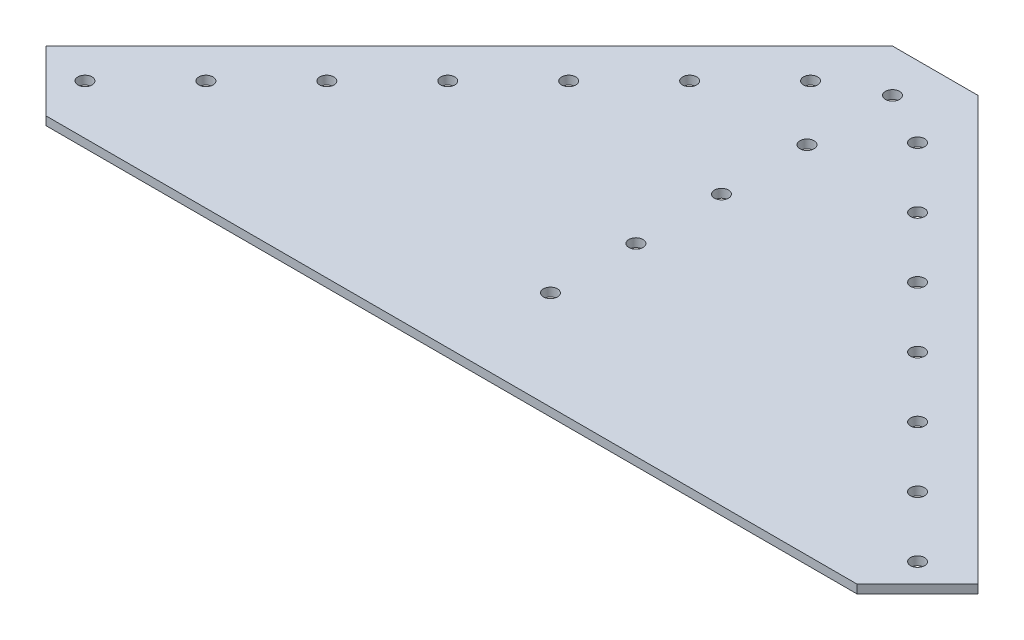
ISO-10303-21;
HEADER;
FILE_DESCRIPTION(('STEP AP214'),'2;1');
FILE_NAME('part.step','',(''),(''),'','','');
FILE_SCHEMA(('AUTOMOTIVE_DESIGN { 1 0 10303 214 1 1 1 1 }'));
ENDSEC;
DATA;
#1=APPLICATION_CONTEXT('core data for automotive mechanical design processes');
#2=APPLICATION_PROTOCOL_DEFINITION('international standard','automotive_design',2000,#1);
#3=PRODUCT_CONTEXT('',#1,'mechanical');
#4=PRODUCT('Part','Part','',(#3));
#5=PRODUCT_RELATED_PRODUCT_CATEGORY('part','',(#4));
#6=PRODUCT_DEFINITION_FORMATION('','',#4);
#7=PRODUCT_DEFINITION_CONTEXT('part definition',#1,'design');
#8=PRODUCT_DEFINITION('design','',#6,#7);
#9=PRODUCT_DEFINITION_SHAPE('','',#8);
#10=(LENGTH_UNIT() NAMED_UNIT(*) SI_UNIT(.MILLI.,.METRE.));
#11=(NAMED_UNIT(*) PLANE_ANGLE_UNIT() SI_UNIT($,.RADIAN.));
#12=(NAMED_UNIT(*) SI_UNIT($,.STERADIAN.) SOLID_ANGLE_UNIT());
#13=UNCERTAINTY_MEASURE_WITH_UNIT(LENGTH_MEASURE(1.E-05),#10,'distance_accuracy_value','');
#14=(GEOMETRIC_REPRESENTATION_CONTEXT(3) GLOBAL_UNCERTAINTY_ASSIGNED_CONTEXT((#13)) GLOBAL_UNIT_ASSIGNED_CONTEXT((#10,
#11,#12)) REPRESENTATION_CONTEXT('',''));
#15=CARTESIAN_POINT('',(0.,0.,0.));
#16=DIRECTION('',(0.,0.,1.));
#17=DIRECTION('',(1.,0.,0.));
#18=AXIS2_PLACEMENT_3D('',#15,#16,#17);
#19=CARTESIAN_POINT('',(0.,2.54,0.));
#20=DIRECTION('',(0.707106781186548,0.,0.707106781186548));
#21=DIRECTION('',(0.707106781186548,0.,-0.707106781186548));
#22=AXIS2_PLACEMENT_3D('',#19,#20,#21);
#23=PLANE('',#22);
#24=DIRECTION('',(-0.707106781186547,0.,0.707106781186547));
#25=VECTOR('',#24,1.);
#26=CARTESIAN_POINT('',(0.,0.,0.));
#27=LINE('',#26,#25);
#28=CARTESIAN_POINT('',(0.,0.,0.));
#29=VERTEX_POINT('',#28);
#30=CARTESIAN_POINT('',(-125.723585694968,0.,125.723585694968));
#31=VERTEX_POINT('',#30);
#32=EDGE_CURVE('E142',#29,#31,#27,.T.);
#33=ORIENTED_EDGE('',*,*,#32,.T.);
#34=DIRECTION('',(0.,-1.,0.));
#35=VECTOR('',#34,1.);
#36=CARTESIAN_POINT('',(-125.723585694968,2.54,125.723585694968));
#37=LINE('',#36,#35);
#38=CARTESIAN_POINT('',(-125.723585694968,2.54,125.723585694968));
#39=VERTEX_POINT('',#38);
#40=EDGE_CURVE('E11',#39,#31,#37,.T.);
#41=ORIENTED_EDGE('',*,*,#40,.F.);
#42=DIRECTION('',(-0.707106781186547,0.,0.707106781186547));
#43=VECTOR('',#42,1.);
#44=CARTESIAN_POINT('',(0.,2.54,0.));
#45=LINE('',#44,#43);
#46=CARTESIAN_POINT('',(0.,2.54,0.));
#47=VERTEX_POINT('',#46);
#48=EDGE_CURVE('E159',#47,#39,#45,.T.);
#49=ORIENTED_EDGE('',*,*,#48,.F.);
#50=DIRECTION('',(0.,-1.,0.));
#51=VECTOR('',#50,1.);
#52=CARTESIAN_POINT('',(0.,2.54,0.));
#53=LINE('',#52,#51);
#54=EDGE_CURVE('E138',#47,#29,#53,.T.);
#55=ORIENTED_EDGE('',*,*,#54,.T.);
#56=EDGE_LOOP('',(#33,#41,#49,#55));
#57=FACE_BOUND('',#56,.T.);
#58=ADVANCED_FACE('F42',(#57),#23,.F.);
#59=CARTESIAN_POINT('',(-125.723585694968,2.54,125.723585694968));
#60=DIRECTION('',(0.707106781186547,0.,-0.707106781186548));
#61=DIRECTION('',(-0.707106781186548,0.,-0.707106781186547));
#62=AXIS2_PLACEMENT_3D('',#59,#60,#61);
#63=PLANE('',#62);
#64=DIRECTION('',(0.707106781186548,0.,0.707106781186547));
#65=VECTOR('',#64,1.);
#66=CARTESIAN_POINT('',(-125.723585694968,0.,125.723585694968));
#67=LINE('',#66,#65);
#68=CARTESIAN_POINT('',(-107.76307345283,0.,143.684097937106));
#69=VERTEX_POINT('',#68);
#70=EDGE_CURVE('E146',#31,#69,#67,.T.);
#71=ORIENTED_EDGE('',*,*,#70,.T.);
#72=DIRECTION('',(0.,-1.,0.));
#73=VECTOR('',#72,1.);
#74=CARTESIAN_POINT('',(-107.76307345283,2.54,143.684097937106));
#75=LINE('',#74,#73);
#76=CARTESIAN_POINT('',(-107.76307345283,2.54,143.684097937106));
#77=VERTEX_POINT('',#76);
#78=EDGE_CURVE('E50',#77,#69,#75,.T.);
#79=ORIENTED_EDGE('',*,*,#78,.F.);
#80=DIRECTION('',(0.707106781186548,0.,0.707106781186547));
#81=VECTOR('',#80,1.);
#82=CARTESIAN_POINT('',(-125.723585694968,2.54,125.723585694968));
#83=LINE('',#82,#81);
#84=EDGE_CURVE('E102',#39,#77,#83,.T.);
#85=ORIENTED_EDGE('',*,*,#84,.F.);
#86=ORIENTED_EDGE('',*,*,#40,.T.);
#87=EDGE_LOOP('',(#71,#79,#85,#86));
#88=FACE_BOUND('',#87,.T.);
#89=ADVANCED_FACE('F186',(#88),#63,.F.);
#90=CARTESIAN_POINT('',(-107.76307345283,2.54,143.684097937106));
#91=DIRECTION('',(0.,0.,-1.));
#92=DIRECTION('',(-1.,0.,0.));
#93=AXIS2_PLACEMENT_3D('',#90,#91,#92);
#94=PLANE('',#93);
#95=DIRECTION('',(1.,0.,0.));
#96=VECTOR('',#95,1.);
#97=CARTESIAN_POINT('',(-107.76307345283,0.,143.684097937106));
#98=LINE('',#97,#96);
#99=CARTESIAN_POINT('',(133.16307345283,0.,143.684097937106));
#100=VERTEX_POINT('',#99);
#101=EDGE_CURVE('E150',#69,#100,#98,.T.);
#102=ORIENTED_EDGE('',*,*,#101,.T.);
#103=DIRECTION('',(0.,-1.,0.));
#104=VECTOR('',#103,1.);
#105=CARTESIAN_POINT('',(133.16307345283,2.54,143.684097937106));
#106=LINE('',#105,#104);
#107=CARTESIAN_POINT('',(133.16307345283,2.54,143.684097937106));
#108=VERTEX_POINT('',#107);
#109=EDGE_CURVE('E129',#108,#100,#106,.T.);
#110=ORIENTED_EDGE('',*,*,#109,.F.);
#111=DIRECTION('',(1.,0.,0.));
#112=VECTOR('',#111,1.);
#113=CARTESIAN_POINT('',(-107.76307345283,2.54,143.684097937106));
#114=LINE('',#113,#112);
#115=EDGE_CURVE('E118',#77,#108,#114,.T.);
#116=ORIENTED_EDGE('',*,*,#115,.F.);
#117=ORIENTED_EDGE('',*,*,#78,.T.);
#118=EDGE_LOOP('',(#102,#110,#116,#117));
#119=FACE_BOUND('',#118,.T.);
#120=ADVANCED_FACE('F167',(#119),#94,.F.);
#121=CARTESIAN_POINT('',(151.123585694968,2.54,125.723585694968));
#122=DIRECTION('',(-0.707106781186548,0.,-0.707106781186547));
#123=DIRECTION('',(-0.707106781186547,0.,0.707106781186548));
#124=AXIS2_PLACEMENT_3D('',#121,#122,#123);
#125=PLANE('',#124);
#126=DIRECTION('',(0.707106781186547,0.,-0.707106781186548));
#127=VECTOR('',#126,1.);
#128=CARTESIAN_POINT('',(151.123585694968,0.,125.723585694968));
#129=LINE('',#128,#127);
#130=CARTESIAN_POINT('',(151.123585694968,0.,125.723585694968));
#131=VERTEX_POINT('',#130);
#132=EDGE_CURVE('E127',#100,#131,#129,.T.);
#133=ORIENTED_EDGE('',*,*,#132,.T.);
#134=DIRECTION('',(0.,-1.,0.));
#135=VECTOR('',#134,1.);
#136=CARTESIAN_POINT('',(151.123585694968,2.54,125.723585694968));
#137=LINE('',#136,#135);
#138=CARTESIAN_POINT('',(151.123585694968,2.54,125.723585694968));
#139=VERTEX_POINT('',#138);
#140=EDGE_CURVE('E124',#139,#131,#137,.T.);
#141=ORIENTED_EDGE('',*,*,#140,.F.);
#142=DIRECTION('',(0.707106781186547,0.,-0.707106781186548));
#143=VECTOR('',#142,1.);
#144=CARTESIAN_POINT('',(151.123585694968,2.54,125.723585694968));
#145=LINE('',#144,#143);
#146=EDGE_CURVE('E112',#108,#139,#145,.T.);
#147=ORIENTED_EDGE('',*,*,#146,.F.);
#148=ORIENTED_EDGE('',*,*,#109,.T.);
#149=EDGE_LOOP('',(#133,#141,#147,#148));
#150=FACE_BOUND('',#149,.T.);
#151=ADVANCED_FACE('F125',(#150),#125,.F.);
#152=CARTESIAN_POINT('',(25.4,2.54,0.));
#153=DIRECTION('',(-0.707106781186548,0.,0.707106781186548));
#154=DIRECTION('',(0.707106781186548,0.,0.707106781186548));
#155=AXIS2_PLACEMENT_3D('',#152,#153,#154);
#156=PLANE('',#155);
#157=DIRECTION('',(-0.707106781186547,0.,-0.707106781186547));
#158=VECTOR('',#157,1.);
#159=CARTESIAN_POINT('',(25.4,0.,0.));
#160=LINE('',#159,#158);
#161=CARTESIAN_POINT('',(25.4,0.,0.));
#162=VERTEX_POINT('',#161);
#163=EDGE_CURVE('E88',#131,#162,#160,.T.);
#164=ORIENTED_EDGE('',*,*,#163,.T.);
#165=DIRECTION('',(0.,-1.,0.));
#166=VECTOR('',#165,1.);
#167=CARTESIAN_POINT('',(25.4,2.54,0.));
#168=LINE('',#167,#166);
#169=CARTESIAN_POINT('',(25.4,2.54,0.));
#170=VERTEX_POINT('',#169);
#171=EDGE_CURVE('E130',#170,#162,#168,.T.);
#172=ORIENTED_EDGE('',*,*,#171,.F.);
#173=DIRECTION('',(-0.707106781186547,0.,-0.707106781186547));
#174=VECTOR('',#173,1.);
#175=CARTESIAN_POINT('',(25.4,2.54,0.));
#176=LINE('',#175,#174);
#177=EDGE_CURVE('E116',#139,#170,#176,.T.);
#178=ORIENTED_EDGE('',*,*,#177,.F.);
#179=ORIENTED_EDGE('',*,*,#140,.T.);
#180=EDGE_LOOP('',(#164,#172,#178,#179));
#181=FACE_BOUND('',#180,.T.);
#182=ADVANCED_FACE('F132',(#181),#156,.F.);
#183=CARTESIAN_POINT('',(0.,2.54,0.));
#184=DIRECTION('',(0.,0.,1.));
#185=DIRECTION('',(1.,0.,0.));
#186=AXIS2_PLACEMENT_3D('',#183,#184,#185);
#187=PLANE('',#186);
#188=DIRECTION('',(-1.,0.,0.));
#189=VECTOR('',#188,1.);
#190=CARTESIAN_POINT('',(0.,0.,0.));
#191=LINE('',#190,#189);
#192=EDGE_CURVE('E94',#162,#29,#191,.T.);
#193=ORIENTED_EDGE('',*,*,#192,.T.);
#194=ORIENTED_EDGE('',*,*,#54,.F.);
#195=DIRECTION('',(-1.,0.,0.));
#196=VECTOR('',#195,1.);
#197=CARTESIAN_POINT('',(0.,2.54,0.));
#198=LINE('',#197,#196);
#199=EDGE_CURVE('E61',#170,#47,#198,.T.);
#200=ORIENTED_EDGE('',*,*,#199,.F.);
#201=ORIENTED_EDGE('',*,*,#171,.T.);
#202=EDGE_LOOP('',(#193,#194,#200,#201));
#203=FACE_BOUND('',#202,.T.);
#204=ADVANCED_FACE('F174',(#203),#187,.F.);
#205=CARTESIAN_POINT('',(0.,2.54,0.));
#206=DIRECTION('',(0.,1.,0.));
#207=DIRECTION('',(0.,0.,1.));
#208=AXIS2_PLACEMENT_3D('',#205,#206,#207);
#209=PLANE('',#208);
#210=CARTESIAN_POINT('',(-21.151548004717,2.54,39.1120602468554));
#211=DIRECTION('',(0.,-1.,0.));
#212=DIRECTION('',(0.,0.,-1.));
#213=AXIS2_PLACEMENT_3D('',#210,#211,#212);
#214=CIRCLE('',#213,2.09549999999999);
#215=CARTESIAN_POINT('',(-21.151548004717,2.54,37.0165602468554));
#216=VERTEX_POINT('',#215);
#217=EDGE_CURVE('E444',#216,#216,#214,.T.);
#218=ORIENTED_EDGE('',*,*,#217,.T.);
#219=EDGE_LOOP('',(#218));
#220=FACE_BOUND('',#219,.T.);
#221=CARTESIAN_POINT('',(-39.1120602468553,2.54,57.0725724889937));
#222=DIRECTION('',(0.,-1.,0.));
#223=DIRECTION('',(0.,0.,-1.));
#224=AXIS2_PLACEMENT_3D('',#221,#222,#223);
#225=CIRCLE('',#224,2.09549999999999);
#226=CARTESIAN_POINT('',(-39.1120602468553,2.54,54.9770724889937));
#227=VERTEX_POINT('',#226);
#228=EDGE_CURVE('E458',#227,#227,#225,.T.);
#229=ORIENTED_EDGE('',*,*,#228,.T.);
#230=EDGE_LOOP('',(#229));
#231=FACE_BOUND('',#230,.T.);
#232=CARTESIAN_POINT('',(-57.0725724889936,2.54,75.033084731132));
#233=DIRECTION('',(0.,-1.,0.));
#234=DIRECTION('',(0.,0.,-1.));
#235=AXIS2_PLACEMENT_3D('',#232,#233,#234);
#236=CIRCLE('',#235,2.09549999999999);
#237=CARTESIAN_POINT('',(-57.0725724889936,2.54,72.937584731132));
#238=VERTEX_POINT('',#237);
#239=EDGE_CURVE('E465',#238,#238,#236,.T.);
#240=ORIENTED_EDGE('',*,*,#239,.T.);
#241=EDGE_LOOP('',(#240));
#242=FACE_BOUND('',#241,.T.);
#243=CARTESIAN_POINT('',(-75.0330847311319,2.54,92.9935969732703));
#244=DIRECTION('',(0.,-1.,0.));
#245=DIRECTION('',(0.,0.,-1.));
#246=AXIS2_PLACEMENT_3D('',#243,#244,#245);
#247=CIRCLE('',#246,2.09549999999999);
#248=CARTESIAN_POINT('',(-75.0330847311319,2.54,90.8980969732703));
#249=VERTEX_POINT('',#248);
#250=EDGE_CURVE('E473',#249,#249,#247,.T.);
#251=ORIENTED_EDGE('',*,*,#250,.T.);
#252=EDGE_LOOP('',(#251));
#253=FACE_BOUND('',#252,.T.);
#254=CARTESIAN_POINT('',(-92.9935969732702,2.54,110.954109215409));
#255=DIRECTION('',(0.,-1.,0.));
#256=DIRECTION('',(0.,0.,-1.));
#257=AXIS2_PLACEMENT_3D('',#254,#255,#256);
#258=CIRCLE('',#257,2.09549999999999);
#259=CARTESIAN_POINT('',(-92.9935969732702,2.54,108.858609215409));
#260=VERTEX_POINT('',#259);
#261=EDGE_CURVE('E481',#260,#260,#258,.T.);
#262=ORIENTED_EDGE('',*,*,#261,.T.);
#263=EDGE_LOOP('',(#262));
#264=FACE_BOUND('',#263,.T.);
#265=CARTESIAN_POINT('',(-110.954109215409,2.54,128.914621457547));
#266=DIRECTION('',(0.,-1.,0.));
#267=DIRECTION('',(0.,0.,-1.));
#268=AXIS2_PLACEMENT_3D('',#265,#266,#267);
#269=CIRCLE('',#268,2.09549999999999);
#270=CARTESIAN_POINT('',(-110.954109215409,2.54,126.819121457547));
#271=VERTEX_POINT('',#270);
#272=EDGE_CURVE('E488',#271,#271,#269,.T.);
#273=ORIENTED_EDGE('',*,*,#272,.T.);
#274=EDGE_LOOP('',(#273));
#275=FACE_BOUND('',#274,.T.);
#276=CARTESIAN_POINT('',(28.5910357625781,2.54,21.1515480047147));
#277=DIRECTION('',(0.,-1.,0.));
#278=DIRECTION('',(0.,0.,-1.));
#279=AXIS2_PLACEMENT_3D('',#276,#277,#278);
#280=CIRCLE('',#279,2.09549999999999);
#281=CARTESIAN_POINT('',(28.5910357625781,2.54,19.0560480047147));
#282=VERTEX_POINT('',#281);
#283=EDGE_CURVE('E495',#282,#282,#280,.T.);
#284=ORIENTED_EDGE('',*,*,#283,.T.);
#285=EDGE_LOOP('',(#284));
#286=FACE_BOUND('',#285,.T.);
#287=CARTESIAN_POINT('',(46.5515480047165,2.54,39.1120602468529));
#288=DIRECTION('',(0.,-1.,0.));
#289=DIRECTION('',(0.,0.,-1.));
#290=AXIS2_PLACEMENT_3D('',#287,#288,#289);
#291=CIRCLE('',#290,2.09549999999999);
#292=CARTESIAN_POINT('',(46.5515480047165,2.54,37.0165602468529));
#293=VERTEX_POINT('',#292);
#294=EDGE_CURVE('E503',#293,#293,#291,.T.);
#295=ORIENTED_EDGE('',*,*,#294,.T.);
#296=EDGE_LOOP('',(#295));
#297=FACE_BOUND('',#296,.T.);
#298=CARTESIAN_POINT('',(64.5120602468549,2.54,57.0725724889912));
#299=DIRECTION('',(0.,-1.,0.));
#300=DIRECTION('',(0.,0.,-1.));
#301=AXIS2_PLACEMENT_3D('',#298,#299,#300);
#302=CIRCLE('',#301,2.09549999999999);
#303=CARTESIAN_POINT('',(64.5120602468549,2.54,54.9770724889912));
#304=VERTEX_POINT('',#303);
#305=EDGE_CURVE('E511',#304,#304,#302,.T.);
#306=ORIENTED_EDGE('',*,*,#305,.T.);
#307=EDGE_LOOP('',(#306));
#308=FACE_BOUND('',#307,.T.);
#309=CARTESIAN_POINT('',(82.4725724889933,2.54,75.0330847311294));
#310=DIRECTION('',(0.,-1.,0.));
#311=DIRECTION('',(0.,0.,-1.));
#312=AXIS2_PLACEMENT_3D('',#309,#310,#311);
#313=CIRCLE('',#312,2.09549999999999);
#314=CARTESIAN_POINT('',(82.4725724889933,2.54,72.9375847311294));
#315=VERTEX_POINT('',#314);
#316=EDGE_CURVE('E519',#315,#315,#313,.T.);
#317=ORIENTED_EDGE('',*,*,#316,.T.);
#318=EDGE_LOOP('',(#317));
#319=FACE_BOUND('',#318,.T.);
#320=CARTESIAN_POINT('',(100.433084731132,2.54,92.9935969732676));
#321=DIRECTION('',(0.,-1.,0.));
#322=DIRECTION('',(0.,0.,-1.));
#323=AXIS2_PLACEMENT_3D('',#320,#321,#322);
#324=CIRCLE('',#323,2.09549999999999);
#325=CARTESIAN_POINT('',(100.433084731132,2.54,90.8980969732677));
#326=VERTEX_POINT('',#325);
#327=EDGE_CURVE('E527',#326,#326,#324,.T.);
#328=ORIENTED_EDGE('',*,*,#327,.T.);
#329=EDGE_LOOP('',(#328));
#330=FACE_BOUND('',#329,.T.);
#331=CARTESIAN_POINT('',(118.39359697327,2.54,110.954109215406));
#332=DIRECTION('',(0.,-1.,0.));
#333=DIRECTION('',(0.,0.,-1.));
#334=AXIS2_PLACEMENT_3D('',#331,#332,#333);
#335=CIRCLE('',#334,2.09549999999999);
#336=CARTESIAN_POINT('',(118.39359697327,2.54,108.858609215406));
#337=VERTEX_POINT('',#336);
#338=EDGE_CURVE('E535',#337,#337,#335,.T.);
#339=ORIENTED_EDGE('',*,*,#338,.T.);
#340=EDGE_LOOP('',(#339));
#341=FACE_BOUND('',#340,.T.);
#342=CARTESIAN_POINT('',(136.354109215408,2.54,128.914621457544));
#343=DIRECTION('',(0.,-1.,0.));
#344=DIRECTION('',(0.,0.,-1.));
#345=AXIS2_PLACEMENT_3D('',#342,#343,#344);
#346=CIRCLE('',#345,2.0955);
#347=CARTESIAN_POINT('',(136.354109215408,2.54,126.819121457544));
#348=VERTEX_POINT('',#347);
#349=EDGE_CURVE('E543',#348,#348,#346,.T.);
#350=ORIENTED_EDGE('',*,*,#349,.T.);
#351=EDGE_LOOP('',(#350));
#352=FACE_BOUND('',#351,.T.);
#353=CARTESIAN_POINT('',(-3.1910357625787,2.54,21.1515480047171));
#354=DIRECTION('',(0.,-1.,0.));
#355=DIRECTION('',(0.,0.,-1.));
#356=AXIS2_PLACEMENT_3D('',#353,#354,#355);
#357=CIRCLE('',#356,2.09549999999999);
#358=CARTESIAN_POINT('',(-3.1910357625787,2.54,19.0560480047171));
#359=VERTEX_POINT('',#358);
#360=EDGE_CURVE('E551',#359,#359,#357,.T.);
#361=ORIENTED_EDGE('',*,*,#360,.T.);
#362=EDGE_LOOP('',(#361));
#363=FACE_BOUND('',#362,.T.);
#364=CARTESIAN_POINT('',(12.7,2.54,12.7));
#365=DIRECTION('',(0.,1.,0.));
#366=DIRECTION('',(0.,0.,1.));
#367=AXIS2_PLACEMENT_3D('',#364,#365,#366);
#368=CIRCLE('',#367,2.0955);
#369=CARTESIAN_POINT('',(12.7,2.54,14.7955));
#370=VERTEX_POINT('',#369);
#371=EDGE_CURVE('E147',#370,#370,#368,.T.);
#372=ORIENTED_EDGE('',*,*,#371,.F.);
#373=EDGE_LOOP('',(#372));
#374=FACE_BOUND('',#373,.T.);
#375=CARTESIAN_POINT('',(12.7000000000003,2.54,38.1));
#376=DIRECTION('',(0.,1.,0.));
#377=DIRECTION('',(0.,0.,1.));
#378=AXIS2_PLACEMENT_3D('',#375,#376,#377);
#379=CIRCLE('',#378,2.0955);
#380=CARTESIAN_POINT('',(12.7000000000003,2.54,40.1955));
#381=VERTEX_POINT('',#380);
#382=EDGE_CURVE('E586',#381,#381,#379,.T.);
#383=ORIENTED_EDGE('',*,*,#382,.F.);
#384=EDGE_LOOP('',(#383));
#385=FACE_BOUND('',#384,.T.);
#386=CARTESIAN_POINT('',(12.7000000000005,2.54,63.5));
#387=DIRECTION('',(0.,1.,0.));
#388=DIRECTION('',(0.,0.,1.));
#389=AXIS2_PLACEMENT_3D('',#386,#387,#388);
#390=CIRCLE('',#389,2.0955);
#391=CARTESIAN_POINT('',(12.7000000000005,2.54,65.5955));
#392=VERTEX_POINT('',#391);
#393=EDGE_CURVE('E582',#392,#392,#390,.T.);
#394=ORIENTED_EDGE('',*,*,#393,.F.);
#395=EDGE_LOOP('',(#394));
#396=FACE_BOUND('',#395,.T.);
#397=CARTESIAN_POINT('',(12.7000000000008,2.54,88.9));
#398=DIRECTION('',(0.,1.,0.));
#399=DIRECTION('',(0.,0.,1.));
#400=AXIS2_PLACEMENT_3D('',#397,#398,#399);
#401=CIRCLE('',#400,2.0955);
#402=CARTESIAN_POINT('',(12.7000000000008,2.54,90.9955));
#403=VERTEX_POINT('',#402);
#404=EDGE_CURVE('E578',#403,#403,#401,.T.);
#405=ORIENTED_EDGE('',*,*,#404,.F.);
#406=EDGE_LOOP('',(#405));
#407=FACE_BOUND('',#406,.T.);
#408=CARTESIAN_POINT('',(12.7000000000011,2.54,114.3));
#409=DIRECTION('',(0.,1.,0.));
#410=DIRECTION('',(0.,0.,1.));
#411=AXIS2_PLACEMENT_3D('',#408,#409,#410);
#412=CIRCLE('',#411,2.0955);
#413=CARTESIAN_POINT('',(12.7000000000011,2.54,116.3955));
#414=VERTEX_POINT('',#413);
#415=EDGE_CURVE('E560',#414,#414,#412,.T.);
#416=ORIENTED_EDGE('',*,*,#415,.F.);
#417=EDGE_LOOP('',(#416));
#418=FACE_BOUND('',#417,.T.);
#419=ORIENTED_EDGE('',*,*,#48,.T.);
#420=ORIENTED_EDGE('',*,*,#84,.T.);
#421=ORIENTED_EDGE('',*,*,#115,.T.);
#422=ORIENTED_EDGE('',*,*,#146,.T.);
#423=ORIENTED_EDGE('',*,*,#177,.T.);
#424=ORIENTED_EDGE('',*,*,#199,.T.);
#425=EDGE_LOOP('',(#419,#420,#421,#422,#423,#424));
#426=FACE_BOUND('',#425,.T.);
#427=ADVANCED_FACE('F114',(#220,#231,#242,#253,#264,#275,#286,#297,#308,#319,#330,#341,#352,
#363,#374,#385,#396,#407,#418,#426),#209,.T.);
#428=CARTESIAN_POINT('',(0.,0.,0.));
#429=DIRECTION('',(0.,1.,0.));
#430=DIRECTION('',(0.,0.,1.));
#431=AXIS2_PLACEMENT_3D('',#428,#429,#430);
#432=PLANE('',#431);
#433=CARTESIAN_POINT('',(-21.151548004717,0.,39.1120602468554));
#434=DIRECTION('',(0.,-1.,0.));
#435=DIRECTION('',(0.,0.,-1.));
#436=AXIS2_PLACEMENT_3D('',#433,#434,#435);
#437=CIRCLE('',#436,2.09549999999999);
#438=CARTESIAN_POINT('',(-21.151548004717,0.,37.0165602468554));
#439=VERTEX_POINT('',#438);
#440=EDGE_CURVE('E447',#439,#439,#437,.T.);
#441=ORIENTED_EDGE('',*,*,#440,.F.);
#442=EDGE_LOOP('',(#441));
#443=FACE_BOUND('',#442,.T.);
#444=CARTESIAN_POINT('',(-39.1120602468553,0.,57.0725724889937));
#445=DIRECTION('',(0.,-1.,0.));
#446=DIRECTION('',(0.,0.,-1.));
#447=AXIS2_PLACEMENT_3D('',#444,#445,#446);
#448=CIRCLE('',#447,2.09549999999999);
#449=CARTESIAN_POINT('',(-39.1120602468553,0.,54.9770724889937));
#450=VERTEX_POINT('',#449);
#451=EDGE_CURVE('E453',#450,#450,#448,.T.);
#452=ORIENTED_EDGE('',*,*,#451,.F.);
#453=EDGE_LOOP('',(#452));
#454=FACE_BOUND('',#453,.T.);
#455=CARTESIAN_POINT('',(-57.0725724889936,0.,75.033084731132));
#456=DIRECTION('',(0.,-1.,0.));
#457=DIRECTION('',(0.,0.,-1.));
#458=AXIS2_PLACEMENT_3D('',#455,#456,#457);
#459=CIRCLE('',#458,2.09549999999999);
#460=CARTESIAN_POINT('',(-57.0725724889936,0.,72.937584731132));
#461=VERTEX_POINT('',#460);
#462=EDGE_CURVE('E461',#461,#461,#459,.T.);
#463=ORIENTED_EDGE('',*,*,#462,.F.);
#464=EDGE_LOOP('',(#463));
#465=FACE_BOUND('',#464,.T.);
#466=CARTESIAN_POINT('',(-75.0330847311319,0.,92.9935969732703));
#467=DIRECTION('',(0.,-1.,0.));
#468=DIRECTION('',(0.,0.,-1.));
#469=AXIS2_PLACEMENT_3D('',#466,#467,#468);
#470=CIRCLE('',#469,2.09549999999999);
#471=CARTESIAN_POINT('',(-75.0330847311319,0.,90.8980969732703));
#472=VERTEX_POINT('',#471);
#473=EDGE_CURVE('E469',#472,#472,#470,.T.);
#474=ORIENTED_EDGE('',*,*,#473,.F.);
#475=EDGE_LOOP('',(#474));
#476=FACE_BOUND('',#475,.T.);
#477=CARTESIAN_POINT('',(-92.9935969732702,0.,110.954109215409));
#478=DIRECTION('',(0.,-1.,0.));
#479=DIRECTION('',(0.,0.,-1.));
#480=AXIS2_PLACEMENT_3D('',#477,#478,#479);
#481=CIRCLE('',#480,2.09549999999999);
#482=CARTESIAN_POINT('',(-92.9935969732702,0.,108.858609215409));
#483=VERTEX_POINT('',#482);
#484=EDGE_CURVE('E477',#483,#483,#481,.T.);
#485=ORIENTED_EDGE('',*,*,#484,.F.);
#486=EDGE_LOOP('',(#485));
#487=FACE_BOUND('',#486,.T.);
#488=CARTESIAN_POINT('',(-110.954109215409,0.,128.914621457547));
#489=DIRECTION('',(0.,-1.,0.));
#490=DIRECTION('',(0.,0.,-1.));
#491=AXIS2_PLACEMENT_3D('',#488,#489,#490);
#492=CIRCLE('',#491,2.09549999999999);
#493=CARTESIAN_POINT('',(-110.954109215409,0.,126.819121457547));
#494=VERTEX_POINT('',#493);
#495=EDGE_CURVE('E485',#494,#494,#492,.T.);
#496=ORIENTED_EDGE('',*,*,#495,.F.);
#497=EDGE_LOOP('',(#496));
#498=FACE_BOUND('',#497,.T.);
#499=CARTESIAN_POINT('',(28.5910357625781,0.,21.1515480047147));
#500=DIRECTION('',(0.,-1.,0.));
#501=DIRECTION('',(0.,0.,-1.));
#502=AXIS2_PLACEMENT_3D('',#499,#500,#501);
#503=CIRCLE('',#502,2.09549999999999);
#504=CARTESIAN_POINT('',(28.5910357625781,0.,19.0560480047147));
#505=VERTEX_POINT('',#504);
#506=EDGE_CURVE('E491',#505,#505,#503,.T.);
#507=ORIENTED_EDGE('',*,*,#506,.F.);
#508=EDGE_LOOP('',(#507));
#509=FACE_BOUND('',#508,.T.);
#510=CARTESIAN_POINT('',(46.5515480047165,0.,39.1120602468529));
#511=DIRECTION('',(0.,-1.,0.));
#512=DIRECTION('',(0.,0.,-1.));
#513=AXIS2_PLACEMENT_3D('',#510,#511,#512);
#514=CIRCLE('',#513,2.09549999999999);
#515=CARTESIAN_POINT('',(46.5515480047165,0.,37.0165602468529));
#516=VERTEX_POINT('',#515);
#517=EDGE_CURVE('E499',#516,#516,#514,.T.);
#518=ORIENTED_EDGE('',*,*,#517,.F.);
#519=EDGE_LOOP('',(#518));
#520=FACE_BOUND('',#519,.T.);
#521=CARTESIAN_POINT('',(64.5120602468549,0.,57.0725724889912));
#522=DIRECTION('',(0.,-1.,0.));
#523=DIRECTION('',(0.,0.,-1.));
#524=AXIS2_PLACEMENT_3D('',#521,#522,#523);
#525=CIRCLE('',#524,2.09549999999999);
#526=CARTESIAN_POINT('',(64.5120602468549,0.,54.9770724889912));
#527=VERTEX_POINT('',#526);
#528=EDGE_CURVE('E507',#527,#527,#525,.T.);
#529=ORIENTED_EDGE('',*,*,#528,.F.);
#530=EDGE_LOOP('',(#529));
#531=FACE_BOUND('',#530,.T.);
#532=CARTESIAN_POINT('',(82.4725724889933,0.,75.0330847311294));
#533=DIRECTION('',(0.,-1.,0.));
#534=DIRECTION('',(0.,0.,-1.));
#535=AXIS2_PLACEMENT_3D('',#532,#533,#534);
#536=CIRCLE('',#535,2.09549999999999);
#537=CARTESIAN_POINT('',(82.4725724889933,0.,72.9375847311294));
#538=VERTEX_POINT('',#537);
#539=EDGE_CURVE('E515',#538,#538,#536,.T.);
#540=ORIENTED_EDGE('',*,*,#539,.F.);
#541=EDGE_LOOP('',(#540));
#542=FACE_BOUND('',#541,.T.);
#543=CARTESIAN_POINT('',(100.433084731132,0.,92.9935969732676));
#544=DIRECTION('',(0.,-1.,0.));
#545=DIRECTION('',(0.,0.,-1.));
#546=AXIS2_PLACEMENT_3D('',#543,#544,#545);
#547=CIRCLE('',#546,2.09549999999999);
#548=CARTESIAN_POINT('',(100.433084731132,0.,90.8980969732677));
#549=VERTEX_POINT('',#548);
#550=EDGE_CURVE('E523',#549,#549,#547,.T.);
#551=ORIENTED_EDGE('',*,*,#550,.F.);
#552=EDGE_LOOP('',(#551));
#553=FACE_BOUND('',#552,.T.);
#554=CARTESIAN_POINT('',(118.39359697327,0.,110.954109215406));
#555=DIRECTION('',(0.,-1.,0.));
#556=DIRECTION('',(0.,0.,-1.));
#557=AXIS2_PLACEMENT_3D('',#554,#555,#556);
#558=CIRCLE('',#557,2.09549999999999);
#559=CARTESIAN_POINT('',(118.39359697327,0.,108.858609215406));
#560=VERTEX_POINT('',#559);
#561=EDGE_CURVE('E531',#560,#560,#558,.T.);
#562=ORIENTED_EDGE('',*,*,#561,.F.);
#563=EDGE_LOOP('',(#562));
#564=FACE_BOUND('',#563,.T.);
#565=CARTESIAN_POINT('',(136.354109215408,0.,128.914621457544));
#566=DIRECTION('',(0.,-1.,0.));
#567=DIRECTION('',(0.,0.,-1.));
#568=AXIS2_PLACEMENT_3D('',#565,#566,#567);
#569=CIRCLE('',#568,2.0955);
#570=CARTESIAN_POINT('',(136.354109215408,0.,126.819121457544));
#571=VERTEX_POINT('',#570);
#572=EDGE_CURVE('E539',#571,#571,#569,.T.);
#573=ORIENTED_EDGE('',*,*,#572,.F.);
#574=EDGE_LOOP('',(#573));
#575=FACE_BOUND('',#574,.T.);
#576=CARTESIAN_POINT('',(-3.1910357625787,0.,21.1515480047171));
#577=DIRECTION('',(0.,-1.,0.));
#578=DIRECTION('',(0.,0.,-1.));
#579=AXIS2_PLACEMENT_3D('',#576,#577,#578);
#580=CIRCLE('',#579,2.09549999999999);
#581=CARTESIAN_POINT('',(-3.1910357625787,0.,19.0560480047171));
#582=VERTEX_POINT('',#581);
#583=EDGE_CURVE('E547',#582,#582,#580,.T.);
#584=ORIENTED_EDGE('',*,*,#583,.F.);
#585=EDGE_LOOP('',(#584));
#586=FACE_BOUND('',#585,.T.);
#587=CARTESIAN_POINT('',(12.7,0.,12.7));
#588=DIRECTION('',(0.,1.,0.));
#589=DIRECTION('',(0.,0.,1.));
#590=AXIS2_PLACEMENT_3D('',#587,#588,#589);
#591=CIRCLE('',#590,2.0955);
#592=CARTESIAN_POINT('',(12.7,0.,14.7955));
#593=VERTEX_POINT('',#592);
#594=EDGE_CURVE('E556',#593,#593,#591,.T.);
#595=ORIENTED_EDGE('',*,*,#594,.T.);
#596=EDGE_LOOP('',(#595));
#597=FACE_BOUND('',#596,.T.);
#598=CARTESIAN_POINT('',(12.7000000000003,0.,38.1));
#599=DIRECTION('',(0.,1.,0.));
#600=DIRECTION('',(0.,0.,1.));
#601=AXIS2_PLACEMENT_3D('',#598,#599,#600);
#602=CIRCLE('',#601,2.0955);
#603=CARTESIAN_POINT('',(12.7000000000003,0.,40.1955));
#604=VERTEX_POINT('',#603);
#605=EDGE_CURVE('E561',#604,#604,#602,.T.);
#606=ORIENTED_EDGE('',*,*,#605,.T.);
#607=EDGE_LOOP('',(#606));
#608=FACE_BOUND('',#607,.T.);
#609=CARTESIAN_POINT('',(12.7000000000005,0.,63.5));
#610=DIRECTION('',(0.,1.,0.));
#611=DIRECTION('',(0.,0.,1.));
#612=AXIS2_PLACEMENT_3D('',#609,#610,#611);
#613=CIRCLE('',#612,2.0955);
#614=CARTESIAN_POINT('',(12.7000000000005,0.,65.5955));
#615=VERTEX_POINT('',#614);
#616=EDGE_CURVE('E564',#615,#615,#613,.T.);
#617=ORIENTED_EDGE('',*,*,#616,.T.);
#618=EDGE_LOOP('',(#617));
#619=FACE_BOUND('',#618,.T.);
#620=CARTESIAN_POINT('',(12.7000000000008,0.,88.9));
#621=DIRECTION('',(0.,1.,0.));
#622=DIRECTION('',(0.,0.,1.));
#623=AXIS2_PLACEMENT_3D('',#620,#621,#622);
#624=CIRCLE('',#623,2.0955);
#625=CARTESIAN_POINT('',(12.7000000000008,0.,90.9955));
#626=VERTEX_POINT('',#625);
#627=EDGE_CURVE('E568',#626,#626,#624,.T.);
#628=ORIENTED_EDGE('',*,*,#627,.T.);
#629=EDGE_LOOP('',(#628));
#630=FACE_BOUND('',#629,.T.);
#631=CARTESIAN_POINT('',(12.7000000000011,0.,114.3));
#632=DIRECTION('',(0.,1.,0.));
#633=DIRECTION('',(0.,0.,1.));
#634=AXIS2_PLACEMENT_3D('',#631,#632,#633);
#635=CIRCLE('',#634,2.0955);
#636=CARTESIAN_POINT('',(12.7000000000011,0.,116.3955));
#637=VERTEX_POINT('',#636);
#638=EDGE_CURVE('E555',#637,#637,#635,.T.);
#639=ORIENTED_EDGE('',*,*,#638,.T.);
#640=EDGE_LOOP('',(#639));
#641=FACE_BOUND('',#640,.T.);
#642=ORIENTED_EDGE('',*,*,#32,.F.);
#643=ORIENTED_EDGE('',*,*,#192,.F.);
#644=ORIENTED_EDGE('',*,*,#163,.F.);
#645=ORIENTED_EDGE('',*,*,#132,.F.);
#646=ORIENTED_EDGE('',*,*,#101,.F.);
#647=ORIENTED_EDGE('',*,*,#70,.F.);
#648=EDGE_LOOP('',(#642,#643,#644,#645,#646,#647));
#649=FACE_BOUND('',#648,.T.);
#650=ADVANCED_FACE('F170',(#443,#454,#465,#476,#487,#498,#509,#520,#531,#542,#553,#564,#575,
#586,#597,#608,#619,#630,#641,#649),#432,.F.);
#651=CARTESIAN_POINT('',(12.7000000000011,0.,114.3));
#652=DIRECTION('',(0.,1.,0.));
#653=DIRECTION('',(0.,0.,1.));
#654=AXIS2_PLACEMENT_3D('',#651,#652,#653);
#655=CYLINDRICAL_SURFACE('',#654,2.0955);
#656=ORIENTED_EDGE('',*,*,#415,.T.);
#657=EDGE_LOOP('',(#656));
#658=FACE_BOUND('',#657,.T.);
#659=ORIENTED_EDGE('',*,*,#638,.F.);
#660=EDGE_LOOP('',(#659));
#661=FACE_BOUND('',#660,.T.);
#662=ADVANCED_FACE('F248',(#658,#661),#655,.F.);
#663=CARTESIAN_POINT('',(12.7000000000008,0.,88.9));
#664=DIRECTION('',(0.,1.,0.));
#665=DIRECTION('',(0.,0.,1.));
#666=AXIS2_PLACEMENT_3D('',#663,#664,#665);
#667=CYLINDRICAL_SURFACE('',#666,2.0955);
#668=ORIENTED_EDGE('',*,*,#404,.T.);
#669=EDGE_LOOP('',(#668));
#670=FACE_BOUND('',#669,.T.);
#671=ORIENTED_EDGE('',*,*,#627,.F.);
#672=EDGE_LOOP('',(#671));
#673=FACE_BOUND('',#672,.T.);
#674=ADVANCED_FACE('F257',(#670,#673),#667,.F.);
#675=CARTESIAN_POINT('',(12.7000000000005,0.,63.5));
#676=DIRECTION('',(0.,1.,0.));
#677=DIRECTION('',(0.,0.,1.));
#678=AXIS2_PLACEMENT_3D('',#675,#676,#677);
#679=CYLINDRICAL_SURFACE('',#678,2.0955);
#680=ORIENTED_EDGE('',*,*,#393,.T.);
#681=EDGE_LOOP('',(#680));
#682=FACE_BOUND('',#681,.T.);
#683=ORIENTED_EDGE('',*,*,#616,.F.);
#684=EDGE_LOOP('',(#683));
#685=FACE_BOUND('',#684,.T.);
#686=ADVANCED_FACE('F266',(#682,#685),#679,.F.);
#687=CARTESIAN_POINT('',(12.7000000000003,0.,38.1));
#688=DIRECTION('',(0.,1.,0.));
#689=DIRECTION('',(0.,0.,1.));
#690=AXIS2_PLACEMENT_3D('',#687,#688,#689);
#691=CYLINDRICAL_SURFACE('',#690,2.0955);
#692=ORIENTED_EDGE('',*,*,#382,.T.);
#693=EDGE_LOOP('',(#692));
#694=FACE_BOUND('',#693,.T.);
#695=ORIENTED_EDGE('',*,*,#605,.F.);
#696=EDGE_LOOP('',(#695));
#697=FACE_BOUND('',#696,.T.);
#698=ADVANCED_FACE('F275',(#694,#697),#691,.F.);
#699=CARTESIAN_POINT('',(12.7,0.,12.7));
#700=DIRECTION('',(0.,1.,0.));
#701=DIRECTION('',(0.,0.,1.));
#702=AXIS2_PLACEMENT_3D('',#699,#700,#701);
#703=CYLINDRICAL_SURFACE('',#702,2.0955);
#704=ORIENTED_EDGE('',*,*,#371,.T.);
#705=EDGE_LOOP('',(#704));
#706=FACE_BOUND('',#705,.T.);
#707=ORIENTED_EDGE('',*,*,#594,.F.);
#708=EDGE_LOOP('',(#707));
#709=FACE_BOUND('',#708,.T.);
#710=ADVANCED_FACE('F284',(#706,#709),#703,.F.);
#711=CARTESIAN_POINT('',(-3.1910357625787,0.,21.1515480047171));
#712=DIRECTION('',(0.,-1.,0.));
#713=DIRECTION('',(0.,0.,-1.));
#714=AXIS2_PLACEMENT_3D('',#711,#712,#713);
#715=CYLINDRICAL_SURFACE('',#714,2.09549999999999);
#716=ORIENTED_EDGE('',*,*,#360,.F.);
#717=EDGE_LOOP('',(#716));
#718=FACE_BOUND('',#717,.T.);
#719=ORIENTED_EDGE('',*,*,#583,.T.);
#720=EDGE_LOOP('',(#719));
#721=FACE_BOUND('',#720,.T.);
#722=ADVANCED_FACE('F292',(#718,#721),#715,.F.);
#723=CARTESIAN_POINT('',(136.354109215408,0.,128.914621457544));
#724=DIRECTION('',(0.,-1.,0.));
#725=DIRECTION('',(0.,0.,-1.));
#726=AXIS2_PLACEMENT_3D('',#723,#724,#725);
#727=CYLINDRICAL_SURFACE('',#726,2.0955);
#728=ORIENTED_EDGE('',*,*,#349,.F.);
#729=EDGE_LOOP('',(#728));
#730=FACE_BOUND('',#729,.T.);
#731=ORIENTED_EDGE('',*,*,#572,.T.);
#732=EDGE_LOOP('',(#731));
#733=FACE_BOUND('',#732,.T.);
#734=ADVANCED_FACE('F300',(#730,#733),#727,.F.);
#735=CARTESIAN_POINT('',(118.39359697327,0.,110.954109215406));
#736=DIRECTION('',(0.,-1.,0.));
#737=DIRECTION('',(0.,0.,-1.));
#738=AXIS2_PLACEMENT_3D('',#735,#736,#737);
#739=CYLINDRICAL_SURFACE('',#738,2.09549999999999);
#740=ORIENTED_EDGE('',*,*,#338,.F.);
#741=EDGE_LOOP('',(#740));
#742=FACE_BOUND('',#741,.T.);
#743=ORIENTED_EDGE('',*,*,#561,.T.);
#744=EDGE_LOOP('',(#743));
#745=FACE_BOUND('',#744,.T.);
#746=ADVANCED_FACE('F309',(#742,#745),#739,.F.);
#747=CARTESIAN_POINT('',(100.433084731132,0.,92.9935969732676));
#748=DIRECTION('',(0.,-1.,0.));
#749=DIRECTION('',(0.,0.,-1.));
#750=AXIS2_PLACEMENT_3D('',#747,#748,#749);
#751=CYLINDRICAL_SURFACE('',#750,2.09549999999999);
#752=ORIENTED_EDGE('',*,*,#327,.F.);
#753=EDGE_LOOP('',(#752));
#754=FACE_BOUND('',#753,.T.);
#755=ORIENTED_EDGE('',*,*,#550,.T.);
#756=EDGE_LOOP('',(#755));
#757=FACE_BOUND('',#756,.T.);
#758=ADVANCED_FACE('F318',(#754,#757),#751,.F.);
#759=CARTESIAN_POINT('',(82.4725724889933,0.,75.0330847311294));
#760=DIRECTION('',(0.,-1.,0.));
#761=DIRECTION('',(0.,0.,-1.));
#762=AXIS2_PLACEMENT_3D('',#759,#760,#761);
#763=CYLINDRICAL_SURFACE('',#762,2.09549999999999);
#764=ORIENTED_EDGE('',*,*,#316,.F.);
#765=EDGE_LOOP('',(#764));
#766=FACE_BOUND('',#765,.T.);
#767=ORIENTED_EDGE('',*,*,#539,.T.);
#768=EDGE_LOOP('',(#767));
#769=FACE_BOUND('',#768,.T.);
#770=ADVANCED_FACE('F327',(#766,#769),#763,.F.);
#771=CARTESIAN_POINT('',(64.5120602468549,0.,57.0725724889912));
#772=DIRECTION('',(0.,-1.,0.));
#773=DIRECTION('',(0.,0.,-1.));
#774=AXIS2_PLACEMENT_3D('',#771,#772,#773);
#775=CYLINDRICAL_SURFACE('',#774,2.09549999999999);
#776=ORIENTED_EDGE('',*,*,#305,.F.);
#777=EDGE_LOOP('',(#776));
#778=FACE_BOUND('',#777,.T.);
#779=ORIENTED_EDGE('',*,*,#528,.T.);
#780=EDGE_LOOP('',(#779));
#781=FACE_BOUND('',#780,.T.);
#782=ADVANCED_FACE('F336',(#778,#781),#775,.F.);
#783=CARTESIAN_POINT('',(46.5515480047165,0.,39.1120602468529));
#784=DIRECTION('',(0.,-1.,0.));
#785=DIRECTION('',(0.,0.,-1.));
#786=AXIS2_PLACEMENT_3D('',#783,#784,#785);
#787=CYLINDRICAL_SURFACE('',#786,2.09549999999999);
#788=ORIENTED_EDGE('',*,*,#294,.F.);
#789=EDGE_LOOP('',(#788));
#790=FACE_BOUND('',#789,.T.);
#791=ORIENTED_EDGE('',*,*,#517,.T.);
#792=EDGE_LOOP('',(#791));
#793=FACE_BOUND('',#792,.T.);
#794=ADVANCED_FACE('F345',(#790,#793),#787,.F.);
#795=CARTESIAN_POINT('',(28.5910357625781,0.,21.1515480047147));
#796=DIRECTION('',(0.,-1.,0.));
#797=DIRECTION('',(0.,0.,-1.));
#798=AXIS2_PLACEMENT_3D('',#795,#796,#797);
#799=CYLINDRICAL_SURFACE('',#798,2.09549999999999);
#800=ORIENTED_EDGE('',*,*,#283,.F.);
#801=EDGE_LOOP('',(#800));
#802=FACE_BOUND('',#801,.T.);
#803=ORIENTED_EDGE('',*,*,#506,.T.);
#804=EDGE_LOOP('',(#803));
#805=FACE_BOUND('',#804,.T.);
#806=ADVANCED_FACE('F354',(#802,#805),#799,.F.);
#807=CARTESIAN_POINT('',(-110.954109215409,0.,128.914621457547));
#808=DIRECTION('',(0.,-1.,0.));
#809=DIRECTION('',(0.,0.,-1.));
#810=AXIS2_PLACEMENT_3D('',#807,#808,#809);
#811=CYLINDRICAL_SURFACE('',#810,2.09549999999999);
#812=ORIENTED_EDGE('',*,*,#272,.F.);
#813=EDGE_LOOP('',(#812));
#814=FACE_BOUND('',#813,.T.);
#815=ORIENTED_EDGE('',*,*,#495,.T.);
#816=EDGE_LOOP('',(#815));
#817=FACE_BOUND('',#816,.T.);
#818=ADVANCED_FACE('F363',(#814,#817),#811,.F.);
#819=CARTESIAN_POINT('',(-92.9935969732702,0.,110.954109215409));
#820=DIRECTION('',(0.,-1.,0.));
#821=DIRECTION('',(0.,0.,-1.));
#822=AXIS2_PLACEMENT_3D('',#819,#820,#821);
#823=CYLINDRICAL_SURFACE('',#822,2.09549999999999);
#824=ORIENTED_EDGE('',*,*,#261,.F.);
#825=EDGE_LOOP('',(#824));
#826=FACE_BOUND('',#825,.T.);
#827=ORIENTED_EDGE('',*,*,#484,.T.);
#828=EDGE_LOOP('',(#827));
#829=FACE_BOUND('',#828,.T.);
#830=ADVANCED_FACE('F372',(#826,#829),#823,.F.);
#831=CARTESIAN_POINT('',(-75.0330847311319,0.,92.9935969732703));
#832=DIRECTION('',(0.,-1.,0.));
#833=DIRECTION('',(0.,0.,-1.));
#834=AXIS2_PLACEMENT_3D('',#831,#832,#833);
#835=CYLINDRICAL_SURFACE('',#834,2.09549999999999);
#836=ORIENTED_EDGE('',*,*,#250,.F.);
#837=EDGE_LOOP('',(#836));
#838=FACE_BOUND('',#837,.T.);
#839=ORIENTED_EDGE('',*,*,#473,.T.);
#840=EDGE_LOOP('',(#839));
#841=FACE_BOUND('',#840,.T.);
#842=ADVANCED_FACE('F381',(#838,#841),#835,.F.);
#843=CARTESIAN_POINT('',(-57.0725724889936,0.,75.033084731132));
#844=DIRECTION('',(0.,-1.,0.));
#845=DIRECTION('',(0.,0.,-1.));
#846=AXIS2_PLACEMENT_3D('',#843,#844,#845);
#847=CYLINDRICAL_SURFACE('',#846,2.09549999999999);
#848=ORIENTED_EDGE('',*,*,#239,.F.);
#849=EDGE_LOOP('',(#848));
#850=FACE_BOUND('',#849,.T.);
#851=ORIENTED_EDGE('',*,*,#462,.T.);
#852=EDGE_LOOP('',(#851));
#853=FACE_BOUND('',#852,.T.);
#854=ADVANCED_FACE('F390',(#850,#853),#847,.F.);
#855=CARTESIAN_POINT('',(-39.1120602468553,0.,57.0725724889937));
#856=DIRECTION('',(0.,-1.,0.));
#857=DIRECTION('',(0.,0.,-1.));
#858=AXIS2_PLACEMENT_3D('',#855,#856,#857);
#859=CYLINDRICAL_SURFACE('',#858,2.09549999999999);
#860=ORIENTED_EDGE('',*,*,#228,.F.);
#861=EDGE_LOOP('',(#860));
#862=FACE_BOUND('',#861,.T.);
#863=ORIENTED_EDGE('',*,*,#451,.T.);
#864=EDGE_LOOP('',(#863));
#865=FACE_BOUND('',#864,.T.);
#866=ADVANCED_FACE('F399',(#862,#865),#859,.F.);
#867=CARTESIAN_POINT('',(-21.151548004717,0.,39.1120602468554));
#868=DIRECTION('',(0.,-1.,0.));
#869=DIRECTION('',(0.,0.,-1.));
#870=AXIS2_PLACEMENT_3D('',#867,#868,#869);
#871=CYLINDRICAL_SURFACE('',#870,2.09549999999999);
#872=ORIENTED_EDGE('',*,*,#217,.F.);
#873=EDGE_LOOP('',(#872));
#874=FACE_BOUND('',#873,.T.);
#875=ORIENTED_EDGE('',*,*,#440,.T.);
#876=EDGE_LOOP('',(#875));
#877=FACE_BOUND('',#876,.T.);
#878=ADVANCED_FACE('F408',(#874,#877),#871,.F.);
#879=CLOSED_SHELL('',(#58,#89,#120,#151,#182,#204,#427,#650,#662,#674,#686,#698,#710,#722,#734,
#746,#758,#770,#782,#794,#806,#818,#830,#842,#854,#866,#878));
#880=MANIFOLD_SOLID_BREP('B2',#879);
#881=ADVANCED_BREP_SHAPE_REPRESENTATION('',(#18,#880),#14);
#882=SHAPE_DEFINITION_REPRESENTATION(#9,#881);
ENDSEC;
END-ISO-10303-21;
